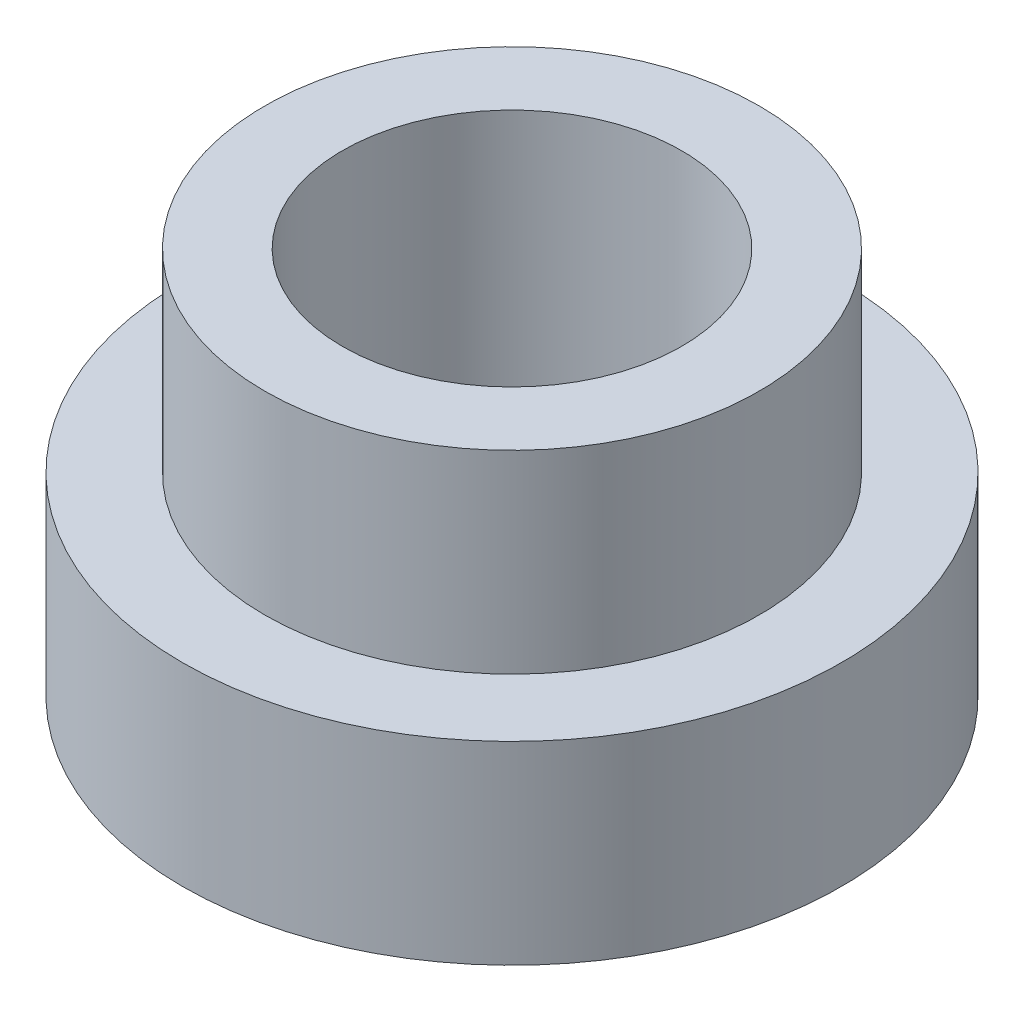
ISO-10303-21;
HEADER;
FILE_DESCRIPTION(('STEP AP214'),'2;1');
FILE_NAME('part.step','',(''),(''),'','','');
FILE_SCHEMA(('AUTOMOTIVE_DESIGN { 1 0 10303 214 1 1 1 1 }'));
ENDSEC;
DATA;
#1=APPLICATION_CONTEXT('core data for automotive mechanical design processes');
#2=APPLICATION_PROTOCOL_DEFINITION('international standard','automotive_design',2000,#1);
#3=PRODUCT_CONTEXT('',#1,'mechanical');
#4=PRODUCT('Part','Part','',(#3));
#5=PRODUCT_RELATED_PRODUCT_CATEGORY('part','',(#4));
#6=PRODUCT_DEFINITION_FORMATION('','',#4);
#7=PRODUCT_DEFINITION_CONTEXT('part definition',#1,'design');
#8=PRODUCT_DEFINITION('design','',#6,#7);
#9=PRODUCT_DEFINITION_SHAPE('','',#8);
#10=(LENGTH_UNIT() NAMED_UNIT(*) SI_UNIT(.MILLI.,.METRE.));
#11=(NAMED_UNIT(*) PLANE_ANGLE_UNIT() SI_UNIT($,.RADIAN.));
#12=(NAMED_UNIT(*) SI_UNIT($,.STERADIAN.) SOLID_ANGLE_UNIT());
#13=UNCERTAINTY_MEASURE_WITH_UNIT(LENGTH_MEASURE(1.E-05),#10,'distance_accuracy_value','');
#14=(GEOMETRIC_REPRESENTATION_CONTEXT(3) GLOBAL_UNCERTAINTY_ASSIGNED_CONTEXT((#13)) GLOBAL_UNIT_ASSIGNED_CONTEXT((#10,
#11,#12)) REPRESENTATION_CONTEXT('',''));
#15=CARTESIAN_POINT('',(0.,0.,0.));
#16=DIRECTION('',(0.,0.,1.));
#17=DIRECTION('',(1.,0.,0.));
#18=AXIS2_PLACEMENT_3D('',#15,#16,#17);
#19=CARTESIAN_POINT('',(0.,4.,0.));
#20=DIRECTION('',(0.,1.,0.));
#21=DIRECTION('',(0.,0.,1.));
#22=AXIS2_PLACEMENT_3D('',#19,#20,#21);
#23=CYLINDRICAL_SURFACE('',#22,1.75);
#24=CARTESIAN_POINT('',(0.,0.,0.));
#25=DIRECTION('',(0.,1.,0.));
#26=DIRECTION('',(0.,0.,1.));
#27=AXIS2_PLACEMENT_3D('',#24,#25,#26);
#28=CIRCLE('',#27,1.75);
#29=CARTESIAN_POINT('',(0.,0.,1.75));
#30=VERTEX_POINT('',#29);
#31=EDGE_CURVE('E61',#30,#30,#28,.T.);
#32=ORIENTED_EDGE('',*,*,#31,.F.);
#33=EDGE_LOOP('',(#32));
#34=FACE_BOUND('',#33,.T.);
#35=CARTESIAN_POINT('',(0.,4.,0.));
#36=DIRECTION('',(0.,1.,0.));
#37=DIRECTION('',(0.,0.,1.));
#38=AXIS2_PLACEMENT_3D('',#35,#36,#37);
#39=CIRCLE('',#38,1.75);
#40=CARTESIAN_POINT('',(0.,4.,1.75));
#41=VERTEX_POINT('',#40);
#42=EDGE_CURVE('E10',#41,#41,#39,.T.);
#43=ORIENTED_EDGE('',*,*,#42,.T.);
#44=EDGE_LOOP('',(#43));
#45=FACE_BOUND('',#44,.T.);
#46=ADVANCED_FACE('F39',(#34,#45),#23,.F.);
#47=CARTESIAN_POINT('',(0.,4.,0.));
#48=DIRECTION('',(0.,-1.,0.));
#49=DIRECTION('',(0.,0.,-1.));
#50=AXIS2_PLACEMENT_3D('',#47,#48,#49);
#51=PLANE('',#50);
#52=ORIENTED_EDGE('',*,*,#42,.F.);
#53=EDGE_LOOP('',(#52));
#54=FACE_BOUND('',#53,.T.);
#55=CARTESIAN_POINT('',(0.,4.,0.));
#56=DIRECTION('',(0.,1.,0.));
#57=DIRECTION('',(0.,0.,1.));
#58=AXIS2_PLACEMENT_3D('',#55,#56,#57);
#59=CIRCLE('',#58,2.55);
#60=CARTESIAN_POINT('',(0.,4.,2.55));
#61=VERTEX_POINT('',#60);
#62=EDGE_CURVE('E44',#61,#61,#59,.T.);
#63=ORIENTED_EDGE('',*,*,#62,.T.);
#64=EDGE_LOOP('',(#63));
#65=FACE_BOUND('',#64,.T.);
#66=ADVANCED_FACE('F67',(#54,#65),#51,.F.);
#67=CARTESIAN_POINT('',(0.,4.,0.));
#68=DIRECTION('',(0.,1.,0.));
#69=DIRECTION('',(0.,0.,1.));
#70=AXIS2_PLACEMENT_3D('',#67,#68,#69);
#71=CYLINDRICAL_SURFACE('',#70,2.55);
#72=ORIENTED_EDGE('',*,*,#62,.F.);
#73=EDGE_LOOP('',(#72));
#74=FACE_BOUND('',#73,.T.);
#75=CARTESIAN_POINT('',(0.,2.,0.));
#76=DIRECTION('',(0.,1.,0.));
#77=DIRECTION('',(0.,0.,1.));
#78=AXIS2_PLACEMENT_3D('',#75,#76,#77);
#79=CIRCLE('',#78,2.55);
#80=CARTESIAN_POINT('',(0.,2.,2.55));
#81=VERTEX_POINT('',#80);
#82=EDGE_CURVE('E47',#81,#81,#79,.T.);
#83=ORIENTED_EDGE('',*,*,#82,.T.);
#84=EDGE_LOOP('',(#83));
#85=FACE_BOUND('',#84,.T.);
#86=ADVANCED_FACE('F75',(#74,#85),#71,.T.);
#87=CARTESIAN_POINT('',(0.,2.,0.));
#88=DIRECTION('',(0.,-1.,0.));
#89=DIRECTION('',(0.,0.,-1.));
#90=AXIS2_PLACEMENT_3D('',#87,#88,#89);
#91=PLANE('',#90);
#92=ORIENTED_EDGE('',*,*,#82,.F.);
#93=EDGE_LOOP('',(#92));
#94=FACE_BOUND('',#93,.T.);
#95=CARTESIAN_POINT('',(0.,2.,0.));
#96=DIRECTION('',(0.,1.,0.));
#97=DIRECTION('',(0.,0.,1.));
#98=AXIS2_PLACEMENT_3D('',#95,#96,#97);
#99=CIRCLE('',#98,3.4);
#100=CARTESIAN_POINT('',(0.,2.,3.4));
#101=VERTEX_POINT('',#100);
#102=EDGE_CURVE('E52',#101,#101,#99,.T.);
#103=ORIENTED_EDGE('',*,*,#102,.T.);
#104=EDGE_LOOP('',(#103));
#105=FACE_BOUND('',#104,.T.);
#106=ADVANCED_FACE('F80',(#94,#105),#91,.F.);
#107=CARTESIAN_POINT('',(0.,4.,0.));
#108=DIRECTION('',(0.,1.,0.));
#109=DIRECTION('',(0.,0.,1.));
#110=AXIS2_PLACEMENT_3D('',#107,#108,#109);
#111=CYLINDRICAL_SURFACE('',#110,3.4);
#112=ORIENTED_EDGE('',*,*,#102,.F.);
#113=EDGE_LOOP('',(#112));
#114=FACE_BOUND('',#113,.T.);
#115=CARTESIAN_POINT('',(0.,0.,0.));
#116=DIRECTION('',(0.,1.,0.));
#117=DIRECTION('',(0.,0.,1.));
#118=AXIS2_PLACEMENT_3D('',#115,#116,#117);
#119=CIRCLE('',#118,3.4);
#120=CARTESIAN_POINT('',(0.,0.,3.4));
#121=VERTEX_POINT('',#120);
#122=EDGE_CURVE('E59',#121,#121,#119,.T.);
#123=ORIENTED_EDGE('',*,*,#122,.T.);
#124=EDGE_LOOP('',(#123));
#125=FACE_BOUND('',#124,.T.);
#126=ADVANCED_FACE('F82',(#114,#125),#111,.T.);
#127=CARTESIAN_POINT('',(0.,0.,0.));
#128=DIRECTION('',(0.,1.,0.));
#129=DIRECTION('',(0.,0.,1.));
#130=AXIS2_PLACEMENT_3D('',#127,#128,#129);
#131=PLANE('',#130);
#132=ORIENTED_EDGE('',*,*,#122,.F.);
#133=EDGE_LOOP('',(#132));
#134=FACE_BOUND('',#133,.T.);
#135=ORIENTED_EDGE('',*,*,#31,.T.);
#136=EDGE_LOOP('',(#135));
#137=FACE_BOUND('',#136,.T.);
#138=ADVANCED_FACE('F64',(#134,#137),#131,.F.);
#139=CLOSED_SHELL('',(#46,#66,#86,#106,#126,#138));
#140=MANIFOLD_SOLID_BREP('B2',#139);
#141=ADVANCED_BREP_SHAPE_REPRESENTATION('',(#18,#140),#14);
#142=SHAPE_DEFINITION_REPRESENTATION(#9,#141);
ENDSEC;
END-ISO-10303-21;
